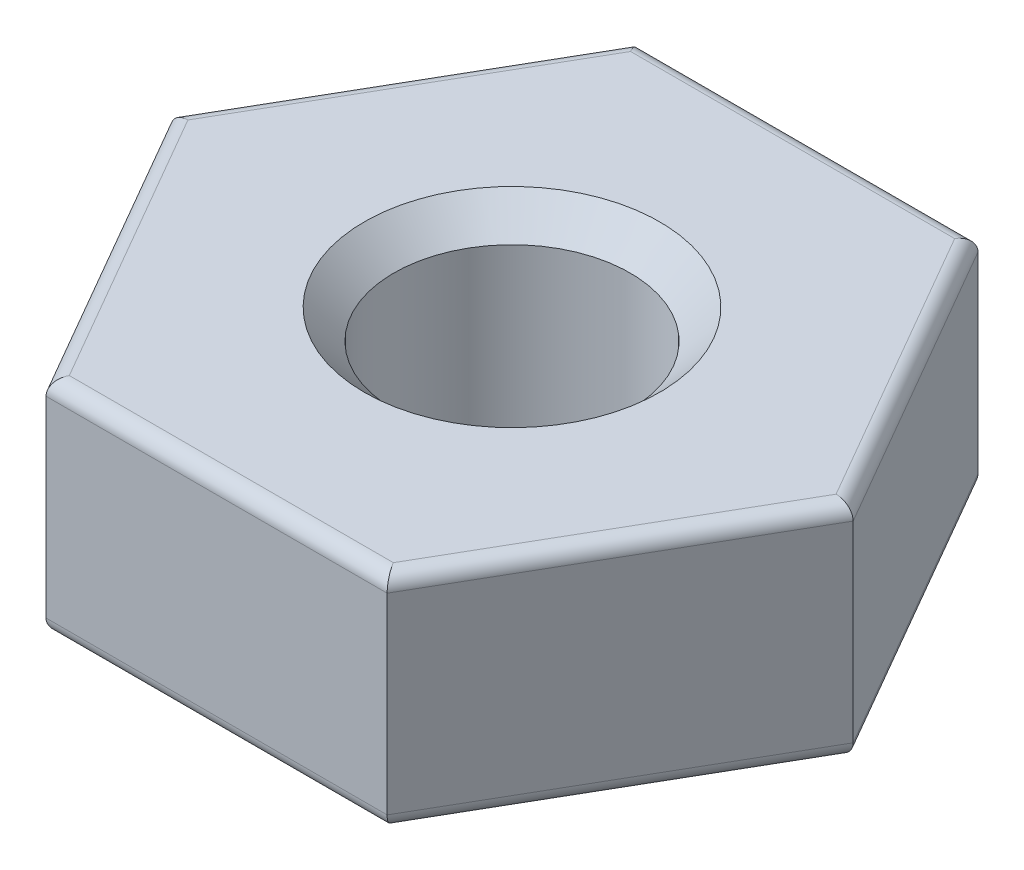
ISO-10303-21;
HEADER;
FILE_DESCRIPTION(('STEP AP214'),'2;1');
FILE_NAME('part.step','',(''),(''),'','','');
FILE_SCHEMA(('AUTOMOTIVE_DESIGN { 1 0 10303 214 1 1 1 1 }'));
ENDSEC;
DATA;
#1=APPLICATION_CONTEXT('core data for automotive mechanical design processes');
#2=APPLICATION_PROTOCOL_DEFINITION('international standard','automotive_design',2000,#1);
#3=PRODUCT_CONTEXT('',#1,'mechanical');
#4=PRODUCT('Part','Part','',(#3));
#5=PRODUCT_RELATED_PRODUCT_CATEGORY('part','',(#4));
#6=PRODUCT_DEFINITION_FORMATION('','',#4);
#7=PRODUCT_DEFINITION_CONTEXT('part definition',#1,'design');
#8=PRODUCT_DEFINITION('design','',#6,#7);
#9=PRODUCT_DEFINITION_SHAPE('','',#8);
#10=(LENGTH_UNIT() NAMED_UNIT(*) SI_UNIT(.MILLI.,.METRE.));
#11=(NAMED_UNIT(*) PLANE_ANGLE_UNIT() SI_UNIT($,.RADIAN.));
#12=(NAMED_UNIT(*) SI_UNIT($,.STERADIAN.) SOLID_ANGLE_UNIT());
#13=UNCERTAINTY_MEASURE_WITH_UNIT(LENGTH_MEASURE(1.E-05),#10,'distance_accuracy_value','');
#14=(GEOMETRIC_REPRESENTATION_CONTEXT(3) GLOBAL_UNCERTAINTY_ASSIGNED_CONTEXT((#13)) GLOBAL_UNIT_ASSIGNED_CONTEXT((#10,
#11,#12)) REPRESENTATION_CONTEXT('',''));
#15=CARTESIAN_POINT('',(0.,0.,0.));
#16=DIRECTION('',(0.,0.,1.));
#17=DIRECTION('',(1.,0.,0.));
#18=AXIS2_PLACEMENT_3D('',#15,#16,#17);
#19=CARTESIAN_POINT('',(1.15470053837927,1.5,1.99999999999998));
#20=DIRECTION('',(-0.866025403784441,0.,-0.499999999999995));
#21=DIRECTION('',(-0.499999999999995,0.,0.866025403784442));
#22=AXIS2_PLACEMENT_3D('',#19,#20,#21);
#23=PLANE('',#22);
#24=DIRECTION('',(0.,-1.,0.));
#25=VECTOR('',#24,1.);
#26=CARTESIAN_POINT('',(2.30940107675849,1.5,0.));
#27=LINE('',#26,#25);
#28=CARTESIAN_POINT('',(2.30940107675849,1.4,0.));
#29=VERTEX_POINT('',#28);
#30=CARTESIAN_POINT('',(2.30940107675849,0.1,0.));
#31=VERTEX_POINT('',#30);
#32=EDGE_CURVE('E156',#29,#31,#27,.T.);
#33=ORIENTED_EDGE('',*,*,#32,.F.);
#34=DIRECTION('',(0.499999999999995,0.,-0.866025403784442));
#35=VECTOR('',#34,1.);
#36=CARTESIAN_POINT('',(1.15470053837927,1.4,1.99999999999998));
#37=LINE('',#36,#35);
#38=CARTESIAN_POINT('',(1.15470053837927,1.4,1.99999999999998));
#39=VERTEX_POINT('',#38);
#40=EDGE_CURVE('E189',#29,#39,#37,.F.);
#41=ORIENTED_EDGE('',*,*,#40,.T.);
#42=DIRECTION('',(0.,-1.,0.));
#43=VECTOR('',#42,1.);
#44=CARTESIAN_POINT('',(1.15470053837927,1.5,1.99999999999998));
#45=LINE('',#44,#43);
#46=CARTESIAN_POINT('',(1.15470053837927,0.1,1.99999999999998));
#47=VERTEX_POINT('',#46);
#48=EDGE_CURVE('E210',#39,#47,#45,.T.);
#49=ORIENTED_EDGE('',*,*,#48,.T.);
#50=DIRECTION('',(0.499999999999995,0.,-0.866025403784442));
#51=VECTOR('',#50,1.);
#52=CARTESIAN_POINT('',(1.15470053837927,0.1,1.99999999999998));
#53=LINE('',#52,#51);
#54=EDGE_CURVE('E187',#47,#31,#53,.T.);
#55=ORIENTED_EDGE('',*,*,#54,.T.);
#56=EDGE_LOOP('',(#33,#41,#49,#55));
#57=FACE_BOUND('',#56,.T.);
#58=ADVANCED_FACE('F47',(#57),#23,.F.);
#59=CARTESIAN_POINT('',(2.30940107675849,1.5,0.));
#60=DIRECTION('',(-0.866025403784438,0.,0.500000000000001));
#61=DIRECTION('',(0.500000000000001,0.,0.866025403784438));
#62=AXIS2_PLACEMENT_3D('',#59,#60,#61);
#63=PLANE('',#62);
#64=DIRECTION('',(0.,-1.,0.));
#65=VECTOR('',#64,1.);
#66=CARTESIAN_POINT('',(1.15470053837924,1.5,-1.99999999999999));
#67=LINE('',#66,#65);
#68=CARTESIAN_POINT('',(1.15470053837924,1.4,-1.99999999999999));
#69=VERTEX_POINT('',#68);
#70=CARTESIAN_POINT('',(1.15470053837924,0.1,-1.99999999999999));
#71=VERTEX_POINT('',#70);
#72=EDGE_CURVE('E253',#69,#71,#67,.T.);
#73=ORIENTED_EDGE('',*,*,#72,.F.);
#74=DIRECTION('',(-0.500000000000001,0.,-0.866025403784438));
#75=VECTOR('',#74,1.);
#76=CARTESIAN_POINT('',(2.30940107675849,1.4,0.));
#77=LINE('',#76,#75);
#78=EDGE_CURVE('E185',#69,#29,#77,.F.);
#79=ORIENTED_EDGE('',*,*,#78,.T.);
#80=ORIENTED_EDGE('',*,*,#32,.T.);
#81=DIRECTION('',(-0.500000000000001,0.,-0.866025403784438));
#82=VECTOR('',#81,1.);
#83=CARTESIAN_POINT('',(2.30940107675849,0.1,0.));
#84=LINE('',#83,#82);
#85=EDGE_CURVE('E182',#31,#71,#84,.T.);
#86=ORIENTED_EDGE('',*,*,#85,.T.);
#87=EDGE_LOOP('',(#73,#79,#80,#86));
#88=FACE_BOUND('',#87,.T.);
#89=ADVANCED_FACE('F250',(#88),#63,.F.);
#90=CARTESIAN_POINT('',(1.15470053837924,1.5,-1.99999999999999));
#91=DIRECTION('',(0.,0.,1.));
#92=DIRECTION('',(1.,0.,0.));
#93=AXIS2_PLACEMENT_3D('',#90,#91,#92);
#94=PLANE('',#93);
#95=DIRECTION('',(0.,-1.,0.));
#96=VECTOR('',#95,1.);
#97=CARTESIAN_POINT('',(-1.15470053837925,1.5,-1.99999999999998));
#98=LINE('',#97,#96);
#99=CARTESIAN_POINT('',(-1.15470053837925,1.4,-1.99999999999998));
#100=VERTEX_POINT('',#99);
#101=CARTESIAN_POINT('',(-1.15470053837925,0.1,-1.99999999999998));
#102=VERTEX_POINT('',#101);
#103=EDGE_CURVE('E255',#100,#102,#98,.T.);
#104=ORIENTED_EDGE('',*,*,#103,.F.);
#105=DIRECTION('',(-1.,0.,0.));
#106=VECTOR('',#105,1.);
#107=CARTESIAN_POINT('',(1.15470053837924,1.4,-1.99999999999999));
#108=LINE('',#107,#106);
#109=EDGE_CURVE('E180',#100,#69,#108,.F.);
#110=ORIENTED_EDGE('',*,*,#109,.T.);
#111=ORIENTED_EDGE('',*,*,#72,.T.);
#112=DIRECTION('',(-1.,0.,0.));
#113=VECTOR('',#112,1.);
#114=CARTESIAN_POINT('',(1.15470053837924,0.1,-1.99999999999999));
#115=LINE('',#114,#113);
#116=EDGE_CURVE('E178',#71,#102,#115,.T.);
#117=ORIENTED_EDGE('',*,*,#116,.T.);
#118=EDGE_LOOP('',(#104,#110,#111,#117));
#119=FACE_BOUND('',#118,.T.);
#120=ADVANCED_FACE('F316',(#119),#94,.F.);
#121=CARTESIAN_POINT('',(-1.15470053837925,1.5,-1.99999999999998));
#122=DIRECTION('',(0.866025403784442,0.,0.499999999999995));
#123=DIRECTION('',(0.499999999999995,0.,-0.866025403784442));
#124=AXIS2_PLACEMENT_3D('',#121,#122,#123);
#125=PLANE('',#124);
#126=DIRECTION('',(0.,-1.,0.));
#127=VECTOR('',#126,1.);
#128=CARTESIAN_POINT('',(-2.30940107675849,1.5,0.));
#129=LINE('',#128,#127);
#130=CARTESIAN_POINT('',(-2.30940107675849,1.4,0.));
#131=VERTEX_POINT('',#130);
#132=CARTESIAN_POINT('',(-2.30940107675849,0.1,0.));
#133=VERTEX_POINT('',#132);
#134=EDGE_CURVE('E280',#131,#133,#129,.T.);
#135=ORIENTED_EDGE('',*,*,#134,.F.);
#136=DIRECTION('',(-0.499999999999995,0.,0.866025403784442));
#137=VECTOR('',#136,1.);
#138=CARTESIAN_POINT('',(-1.15470053837925,1.4,-1.99999999999999));
#139=LINE('',#138,#137);
#140=EDGE_CURVE('E176',#131,#100,#139,.F.);
#141=ORIENTED_EDGE('',*,*,#140,.T.);
#142=ORIENTED_EDGE('',*,*,#103,.T.);
#143=DIRECTION('',(-0.499999999999995,0.,0.866025403784442));
#144=VECTOR('',#143,1.);
#145=CARTESIAN_POINT('',(-1.15470053837925,0.1,-1.99999999999998));
#146=LINE('',#145,#144);
#147=EDGE_CURVE('E174',#102,#133,#146,.T.);
#148=ORIENTED_EDGE('',*,*,#147,.T.);
#149=EDGE_LOOP('',(#135,#141,#142,#148));
#150=FACE_BOUND('',#149,.T.);
#151=ADVANCED_FACE('F288',(#150),#125,.F.);
#152=CARTESIAN_POINT('',(-2.30940107675849,1.5,0.));
#153=DIRECTION('',(0.866025403784434,0.,-0.500000000000007));
#154=DIRECTION('',(-0.500000000000007,0.,-0.866025403784435));
#155=AXIS2_PLACEMENT_3D('',#152,#153,#154);
#156=PLANE('',#155);
#157=DIRECTION('',(0.,-1.,0.));
#158=VECTOR('',#157,1.);
#159=CARTESIAN_POINT('',(-1.15470053837923,1.5,2.));
#160=LINE('',#159,#158);
#161=CARTESIAN_POINT('',(-1.15470053837923,1.4,2.));
#162=VERTEX_POINT('',#161);
#163=CARTESIAN_POINT('',(-1.15470053837923,0.1,2.));
#164=VERTEX_POINT('',#163);
#165=EDGE_CURVE('E278',#162,#164,#160,.T.);
#166=ORIENTED_EDGE('',*,*,#165,.F.);
#167=DIRECTION('',(0.500000000000007,0.,0.866025403784435));
#168=VECTOR('',#167,1.);
#169=CARTESIAN_POINT('',(-2.30940107675849,1.4,0.));
#170=LINE('',#169,#168);
#171=EDGE_CURVE('E172',#162,#131,#170,.F.);
#172=ORIENTED_EDGE('',*,*,#171,.T.);
#173=ORIENTED_EDGE('',*,*,#134,.T.);
#174=DIRECTION('',(0.500000000000007,0.,0.866025403784435));
#175=VECTOR('',#174,1.);
#176=CARTESIAN_POINT('',(-2.30940107675849,0.1,0.));
#177=LINE('',#176,#175);
#178=EDGE_CURVE('E170',#133,#164,#177,.T.);
#179=ORIENTED_EDGE('',*,*,#178,.T.);
#180=EDGE_LOOP('',(#166,#172,#173,#179));
#181=FACE_BOUND('',#180,.T.);
#182=ADVANCED_FACE('F279',(#181),#156,.F.);
#183=CARTESIAN_POINT('',(-1.15470053837923,1.5,2.));
#184=DIRECTION('',(0.,0.,-1.));
#185=DIRECTION('',(-1.,0.,0.));
#186=AXIS2_PLACEMENT_3D('',#183,#184,#185);
#187=PLANE('',#186);
#188=ORIENTED_EDGE('',*,*,#48,.F.);
#189=DIRECTION('',(1.,0.,0.));
#190=VECTOR('',#189,1.);
#191=CARTESIAN_POINT('',(-1.15470053837923,1.4,2.));
#192=LINE('',#191,#190);
#193=EDGE_CURVE('E143',#39,#162,#192,.F.);
#194=ORIENTED_EDGE('',*,*,#193,.T.);
#195=ORIENTED_EDGE('',*,*,#165,.T.);
#196=DIRECTION('',(1.,0.,0.));
#197=VECTOR('',#196,1.);
#198=CARTESIAN_POINT('',(-1.15470053837923,0.1,2.));
#199=LINE('',#198,#197);
#200=EDGE_CURVE('E162',#164,#47,#199,.T.);
#201=ORIENTED_EDGE('',*,*,#200,.T.);
#202=EDGE_LOOP('',(#188,#194,#195,#201));
#203=FACE_BOUND('',#202,.T.);
#204=ADVANCED_FACE('F277',(#203),#187,.F.);
#205=CARTESIAN_POINT('',(0.,1.5,0.));
#206=DIRECTION('',(0.,1.,0.));
#207=DIRECTION('',(0.,0.,1.));
#208=AXIS2_PLACEMENT_3D('',#205,#206,#207);
#209=PLANE('',#208);
#210=CARTESIAN_POINT('',(0.,1.5,0.));
#211=DIRECTION('',(0.,1.,0.));
#212=DIRECTION('',(0.,0.,1.));
#213=AXIS2_PLACEMENT_3D('',#210,#211,#212);
#214=CIRCLE('',#213,1.);
#215=CARTESIAN_POINT('',(0.,1.5,1.));
#216=VERTEX_POINT('',#215);
#217=EDGE_CURVE('E367',#216,#216,#214,.T.);
#218=ORIENTED_EDGE('',*,*,#217,.F.);
#219=EDGE_LOOP('',(#218));
#220=FACE_BOUND('',#219,.T.);
#221=DIRECTION('',(0.500000000000007,0.,0.866025403784435));
#222=VECTOR('',#221,1.);
#223=CARTESIAN_POINT('',(-1.06809799800078,1.5,1.95));
#224=LINE('',#223,#222);
#225=CARTESIAN_POINT('',(-2.19393102292057,1.5,0.));
#226=VERTEX_POINT('',#225);
#227=CARTESIAN_POINT('',(-1.09696551146027,1.5,1.9));
#228=VERTEX_POINT('',#227);
#229=EDGE_CURVE('E160',#226,#228,#224,.T.);
#230=ORIENTED_EDGE('',*,*,#229,.T.);
#231=DIRECTION('',(1.,0.,0.));
#232=VECTOR('',#231,1.);
#233=CARTESIAN_POINT('',(1.15470053837927,1.5,1.89999999999998));
#234=LINE('',#233,#232);
#235=CARTESIAN_POINT('',(1.09696551146031,1.5,1.89999999999998));
#236=VERTEX_POINT('',#235);
#237=EDGE_CURVE('E141',#228,#236,#234,.T.);
#238=ORIENTED_EDGE('',*,*,#237,.T.);
#239=DIRECTION('',(0.499999999999995,0.,-0.866025403784442));
#240=VECTOR('',#239,1.);
#241=CARTESIAN_POINT('',(2.22279853638005,1.5,-0.0500000000000001));
#242=LINE('',#241,#240);
#243=CARTESIAN_POINT('',(2.19393102292057,1.5,0.));
#244=VERTEX_POINT('',#243);
#245=EDGE_CURVE('E149',#236,#244,#242,.T.);
#246=ORIENTED_EDGE('',*,*,#245,.T.);
#247=DIRECTION('',(-0.500000000000001,0.,-0.866025403784438));
#248=VECTOR('',#247,1.);
#249=CARTESIAN_POINT('',(1.0680979980008,1.5,-1.94999999999999));
#250=LINE('',#249,#248);
#251=CARTESIAN_POINT('',(1.09696551146028,1.5,-1.89999999999999));
#252=VERTEX_POINT('',#251);
#253=EDGE_CURVE('E155',#244,#252,#250,.T.);
#254=ORIENTED_EDGE('',*,*,#253,.T.);
#255=DIRECTION('',(-1.,0.,0.));
#256=VECTOR('',#255,1.);
#257=CARTESIAN_POINT('',(-1.15470053837925,1.5,-1.89999999999998));
#258=LINE('',#257,#256);
#259=CARTESIAN_POINT('',(-1.09696551146029,1.5,-1.89999999999999));
#260=VERTEX_POINT('',#259);
#261=EDGE_CURVE('E260',#252,#260,#258,.T.);
#262=ORIENTED_EDGE('',*,*,#261,.T.);
#263=DIRECTION('',(-0.499999999999995,0.,0.866025403784442));
#264=VECTOR('',#263,1.);
#265=CARTESIAN_POINT('',(-2.22279853638005,1.5,0.0500000000000156));
#266=LINE('',#265,#264);
#267=EDGE_CURVE('E165',#260,#226,#266,.T.);
#268=ORIENTED_EDGE('',*,*,#267,.T.);
#269=EDGE_LOOP('',(#230,#238,#246,#254,#262,#268));
#270=FACE_BOUND('',#269,.T.);
#271=ADVANCED_FACE('F158',(#220,#270),#209,.T.);
#272=CARTESIAN_POINT('',(0.,0.,0.));
#273=DIRECTION('',(0.,1.,0.));
#274=DIRECTION('',(0.,0.,1.));
#275=AXIS2_PLACEMENT_3D('',#272,#273,#274);
#276=PLANE('',#275);
#277=CARTESIAN_POINT('',(0.,0.,0.));
#278=DIRECTION('',(0.,1.,0.));
#279=DIRECTION('',(0.,0.,1.));
#280=AXIS2_PLACEMENT_3D('',#277,#278,#279);
#281=CIRCLE('',#280,0.824999999999999);
#282=CARTESIAN_POINT('',(0.,0.,0.824999999999999));
#283=VERTEX_POINT('',#282);
#284=EDGE_CURVE('E368',#283,#283,#281,.T.);
#285=ORIENTED_EDGE('',*,*,#284,.T.);
#286=EDGE_LOOP('',(#285));
#287=FACE_BOUND('',#286,.T.);
#288=DIRECTION('',(-1.,0.,0.));
#289=VECTOR('',#288,1.);
#290=CARTESIAN_POINT('',(0.,0.,-1.89999999999999));
#291=LINE('',#290,#289);
#292=CARTESIAN_POINT('',(-1.09696551146029,0.,-1.89999999999999));
#293=VERTEX_POINT('',#292);
#294=CARTESIAN_POINT('',(1.09696551146028,0.,-1.89999999999999));
#295=VERTEX_POINT('',#294);
#296=EDGE_CURVE('E56',#293,#295,#291,.F.);
#297=ORIENTED_EDGE('',*,*,#296,.T.);
#298=DIRECTION('',(-0.500000000000001,0.,-0.866025403784438));
#299=VECTOR('',#298,1.);
#300=CARTESIAN_POINT('',(1.64544826719042,0.,-0.949999999999997));
#301=LINE('',#300,#299);
#302=CARTESIAN_POINT('',(2.19393102292057,0.,0.));
#303=VERTEX_POINT('',#302);
#304=EDGE_CURVE('E11',#295,#303,#301,.F.);
#305=ORIENTED_EDGE('',*,*,#304,.T.);
#306=DIRECTION('',(0.499999999999995,0.,-0.866025403784442));
#307=VECTOR('',#306,1.);
#308=CARTESIAN_POINT('',(1.64544826719044,0.,0.949999999999989));
#309=LINE('',#308,#307);
#310=CARTESIAN_POINT('',(1.09696551146031,0.,1.89999999999998));
#311=VERTEX_POINT('',#310);
#312=EDGE_CURVE('E191',#303,#311,#309,.F.);
#313=ORIENTED_EDGE('',*,*,#312,.T.);
#314=DIRECTION('',(1.,0.,0.));
#315=VECTOR('',#314,1.);
#316=CARTESIAN_POINT('',(0.,0.,1.89999999999999));
#317=LINE('',#316,#315);
#318=CARTESIAN_POINT('',(-1.09696551146027,0.,1.9));
#319=VERTEX_POINT('',#318);
#320=EDGE_CURVE('E193',#311,#319,#317,.F.);
#321=ORIENTED_EDGE('',*,*,#320,.T.);
#322=DIRECTION('',(0.500000000000007,0.,0.866025403784435));
#323=VECTOR('',#322,1.);
#324=CARTESIAN_POINT('',(-1.64544826719042,0.,0.950000000000008));
#325=LINE('',#324,#323);
#326=CARTESIAN_POINT('',(-2.19393102292057,0.,0.));
#327=VERTEX_POINT('',#326);
#328=EDGE_CURVE('E195',#319,#327,#325,.F.);
#329=ORIENTED_EDGE('',*,*,#328,.T.);
#330=DIRECTION('',(-0.499999999999995,0.,0.866025403784442));
#331=VECTOR('',#330,1.);
#332=CARTESIAN_POINT('',(-1.64544826719043,0.,-0.949999999999985));
#333=LINE('',#332,#331);
#334=EDGE_CURVE('E67',#327,#293,#333,.F.);
#335=ORIENTED_EDGE('',*,*,#334,.T.);
#336=EDGE_LOOP('',(#297,#305,#313,#321,#329,#335));
#337=FACE_BOUND('',#336,.T.);
#338=ADVANCED_FACE('F236',(#287,#337),#276,.F.);
#339=CARTESIAN_POINT('',(0.,1.4,-1.89999999999999));
#340=DIRECTION('',(1.,0.,0.));
#341=DIRECTION('',(0.,0.,-1.));
#342=AXIS2_PLACEMENT_3D('',#339,#340,#341);
#343=CYLINDRICAL_SURFACE('',#342,0.1);
#344=CARTESIAN_POINT('',(1.09696551146028,1.4,-1.89999999999999));
#345=DIRECTION('',(0.86602540378444,0.,0.499999999999998));
#346=DIRECTION('',(-0.499999999999998,0.,0.86602540378444));
#347=AXIS2_PLACEMENT_3D('',#344,#345,#346);
#348=ELLIPSE('',#347,0.115470053837925,0.1);
#349=EDGE_CURVE('E204',#69,#252,#348,.T.);
#350=ORIENTED_EDGE('',*,*,#349,.F.);
#351=ORIENTED_EDGE('',*,*,#109,.F.);
#352=CARTESIAN_POINT('',(-1.09696551146029,1.4,-1.89999999999999));
#353=DIRECTION('',(0.866025403784436,0.,-0.500000000000004));
#354=DIRECTION('',(0.500000000000004,0.,0.866025403784436));
#355=AXIS2_PLACEMENT_3D('',#352,#353,#354);
#356=ELLIPSE('',#355,0.115470053837925,0.1);
#357=EDGE_CURVE('E207',#260,#100,#356,.F.);
#358=ORIENTED_EDGE('',*,*,#357,.F.);
#359=ORIENTED_EDGE('',*,*,#261,.F.);
#360=EDGE_LOOP('',(#350,#351,#358,#359));
#361=FACE_BOUND('',#360,.T.);
#362=ADVANCED_FACE('F331',(#361),#343,.T.);
#363=CARTESIAN_POINT('',(-1.64544826719043,1.4,-0.949999999999985));
#364=DIRECTION('',(0.499999999999995,0.,-0.866025403784442));
#365=DIRECTION('',(-0.866025403784442,0.,-0.499999999999995));
#366=AXIS2_PLACEMENT_3D('',#363,#364,#365);
#367=CYLINDRICAL_SURFACE('',#366,0.1);
#368=ORIENTED_EDGE('',*,*,#357,.T.);
#369=ORIENTED_EDGE('',*,*,#140,.F.);
#370=CARTESIAN_POINT('',(-2.19393102292057,1.4,0.));
#371=DIRECTION('',(0.,0.,-1.));
#372=DIRECTION('',(1.,0.,0.));
#373=AXIS2_PLACEMENT_3D('',#370,#371,#372);
#374=ELLIPSE('',#373,0.115470053837925,0.1);
#375=EDGE_CURVE('E201',#226,#131,#374,.F.);
#376=ORIENTED_EDGE('',*,*,#375,.F.);
#377=ORIENTED_EDGE('',*,*,#267,.F.);
#378=EDGE_LOOP('',(#368,#369,#376,#377));
#379=FACE_BOUND('',#378,.T.);
#380=ADVANCED_FACE('F267',(#379),#367,.T.);
#381=CARTESIAN_POINT('',(1.64544826719042,1.4,-0.949999999999997));
#382=DIRECTION('',(0.500000000000001,0.,0.866025403784438));
#383=DIRECTION('',(0.866025403784438,0.,-0.500000000000001));
#384=AXIS2_PLACEMENT_3D('',#381,#382,#383);
#385=CYLINDRICAL_SURFACE('',#384,0.1);
#386=ORIENTED_EDGE('',*,*,#349,.T.);
#387=ORIENTED_EDGE('',*,*,#253,.F.);
#388=CARTESIAN_POINT('',(2.19393102292057,1.4,0.));
#389=DIRECTION('',(0.,0.,1.));
#390=DIRECTION('',(-1.,0.,0.));
#391=AXIS2_PLACEMENT_3D('',#388,#389,#390);
#392=ELLIPSE('',#391,0.115470053837925,0.1);
#393=EDGE_CURVE('E152',#29,#244,#392,.T.);
#394=ORIENTED_EDGE('',*,*,#393,.F.);
#395=ORIENTED_EDGE('',*,*,#78,.F.);
#396=EDGE_LOOP('',(#386,#387,#394,#395));
#397=FACE_BOUND('',#396,.T.);
#398=ADVANCED_FACE('F326',(#397),#385,.T.);
#399=CARTESIAN_POINT('',(-1.64544826719042,1.4,0.950000000000008));
#400=DIRECTION('',(-0.500000000000007,0.,-0.866025403784435));
#401=DIRECTION('',(-0.866025403784435,0.,0.500000000000007));
#402=AXIS2_PLACEMENT_3D('',#399,#400,#401);
#403=CYLINDRICAL_SURFACE('',#402,0.1);
#404=ORIENTED_EDGE('',*,*,#375,.T.);
#405=ORIENTED_EDGE('',*,*,#171,.F.);
#406=CARTESIAN_POINT('',(-1.09696551146027,1.4,1.9));
#407=DIRECTION('',(-0.866025403784443,0.,-0.499999999999992));
#408=DIRECTION('',(0.499999999999992,0.,-0.866025403784443));
#409=AXIS2_PLACEMENT_3D('',#406,#407,#408);
#410=ELLIPSE('',#409,0.115470053837925,0.1);
#411=EDGE_CURVE('E146',#228,#162,#410,.F.);
#412=ORIENTED_EDGE('',*,*,#411,.F.);
#413=ORIENTED_EDGE('',*,*,#229,.F.);
#414=EDGE_LOOP('',(#404,#405,#412,#413));
#415=FACE_BOUND('',#414,.T.);
#416=ADVANCED_FACE('F270',(#415),#403,.T.);
#417=CARTESIAN_POINT('',(1.64544826719044,1.4,0.949999999999989));
#418=DIRECTION('',(-0.499999999999995,0.,0.866025403784442));
#419=DIRECTION('',(0.866025403784441,0.,0.499999999999995));
#420=AXIS2_PLACEMENT_3D('',#417,#418,#419);
#421=CYLINDRICAL_SURFACE('',#420,0.1);
#422=ORIENTED_EDGE('',*,*,#393,.T.);
#423=ORIENTED_EDGE('',*,*,#245,.F.);
#424=CARTESIAN_POINT('',(1.09696551146031,1.4,1.89999999999998));
#425=DIRECTION('',(-0.866025403784435,0.,0.500000000000007));
#426=DIRECTION('',(0.500000000000007,0.,0.866025403784435));
#427=AXIS2_PLACEMENT_3D('',#424,#425,#426);
#428=ELLIPSE('',#427,0.115470053837925,0.1);
#429=EDGE_CURVE('E137',#39,#236,#428,.T.);
#430=ORIENTED_EDGE('',*,*,#429,.F.);
#431=ORIENTED_EDGE('',*,*,#40,.F.);
#432=EDGE_LOOP('',(#422,#423,#430,#431));
#433=FACE_BOUND('',#432,.T.);
#434=ADVANCED_FACE('F150',(#433),#421,.T.);
#435=CARTESIAN_POINT('',(0.,1.4,1.89999999999999));
#436=DIRECTION('',(-1.,0.,0.));
#437=DIRECTION('',(0.,0.,1.));
#438=AXIS2_PLACEMENT_3D('',#435,#436,#437);
#439=CYLINDRICAL_SURFACE('',#438,0.1);
#440=ORIENTED_EDGE('',*,*,#411,.T.);
#441=ORIENTED_EDGE('',*,*,#193,.F.);
#442=ORIENTED_EDGE('',*,*,#429,.T.);
#443=ORIENTED_EDGE('',*,*,#237,.F.);
#444=EDGE_LOOP('',(#440,#441,#442,#443));
#445=FACE_BOUND('',#444,.T.);
#446=ADVANCED_FACE('F139',(#445),#439,.T.);
#447=CARTESIAN_POINT('',(-2.22279853638005,0.1,-0.0499999999999846));
#448=DIRECTION('',(0.500000000000007,0.,0.866025403784435));
#449=DIRECTION('',(0.866025403784435,0.,-0.500000000000007));
#450=AXIS2_PLACEMENT_3D('',#447,#448,#449);
#451=CYLINDRICAL_SURFACE('',#450,0.1);
#452=CARTESIAN_POINT('',(-2.19393102292057,0.1,0.));
#453=DIRECTION('',(0.,0.,1.));
#454=DIRECTION('',(1.,0.,0.));
#455=AXIS2_PLACEMENT_3D('',#452,#453,#454);
#456=ELLIPSE('',#455,0.115470053837925,0.1);
#457=EDGE_CURVE('E221',#327,#133,#456,.F.);
#458=ORIENTED_EDGE('',*,*,#457,.F.);
#459=ORIENTED_EDGE('',*,*,#328,.F.);
#460=CARTESIAN_POINT('',(-1.09696551146027,0.1,1.9));
#461=DIRECTION('',(0.866025403784443,0.,0.499999999999992));
#462=DIRECTION('',(0.499999999999992,0.,-0.866025403784443));
#463=AXIS2_PLACEMENT_3D('',#460,#461,#462);
#464=ELLIPSE('',#463,0.115470053837925,0.1);
#465=EDGE_CURVE('E51',#164,#319,#464,.T.);
#466=ORIENTED_EDGE('',*,*,#465,.F.);
#467=ORIENTED_EDGE('',*,*,#178,.F.);
#468=EDGE_LOOP('',(#458,#459,#466,#467));
#469=FACE_BOUND('',#468,.T.);
#470=ADVANCED_FACE('F49',(#469),#451,.T.);
#471=CARTESIAN_POINT('',(-1.15470053837923,0.1,1.9));
#472=DIRECTION('',(1.,0.,0.));
#473=DIRECTION('',(0.,0.,-1.));
#474=AXIS2_PLACEMENT_3D('',#471,#472,#473);
#475=CYLINDRICAL_SURFACE('',#474,0.1);
#476=ORIENTED_EDGE('',*,*,#465,.T.);
#477=ORIENTED_EDGE('',*,*,#320,.F.);
#478=CARTESIAN_POINT('',(1.09696551146031,0.1,1.89999999999998));
#479=DIRECTION('',(0.866025403784435,0.,-0.500000000000007));
#480=DIRECTION('',(-0.500000000000007,0.,-0.866025403784435));
#481=AXIS2_PLACEMENT_3D('',#478,#479,#480);
#482=ELLIPSE('',#481,0.115470053837925,0.1);
#483=EDGE_CURVE('E219',#47,#311,#482,.T.);
#484=ORIENTED_EDGE('',*,*,#483,.F.);
#485=ORIENTED_EDGE('',*,*,#200,.F.);
#486=EDGE_LOOP('',(#476,#477,#484,#485));
#487=FACE_BOUND('',#486,.T.);
#488=ADVANCED_FACE('F231',(#487),#475,.T.);
#489=CARTESIAN_POINT('',(-1.06809799800081,0.1,-1.94999999999999));
#490=DIRECTION('',(-0.499999999999995,0.,0.866025403784442));
#491=DIRECTION('',(0.866025403784442,0.,0.499999999999995));
#492=AXIS2_PLACEMENT_3D('',#489,#490,#491);
#493=CYLINDRICAL_SURFACE('',#492,0.1);
#494=ORIENTED_EDGE('',*,*,#457,.T.);
#495=ORIENTED_EDGE('',*,*,#147,.F.);
#496=CARTESIAN_POINT('',(-1.09696551146029,0.1,-1.89999999999999));
#497=DIRECTION('',(-0.866025403784436,0.,0.500000000000004));
#498=DIRECTION('',(0.500000000000004,0.,0.866025403784436));
#499=AXIS2_PLACEMENT_3D('',#496,#497,#498);
#500=ELLIPSE('',#499,0.115470053837925,0.1);
#501=EDGE_CURVE('E216',#293,#102,#500,.F.);
#502=ORIENTED_EDGE('',*,*,#501,.F.);
#503=ORIENTED_EDGE('',*,*,#334,.F.);
#504=EDGE_LOOP('',(#494,#495,#502,#503));
#505=FACE_BOUND('',#504,.T.);
#506=ADVANCED_FACE('F291',(#505),#493,.T.);
#507=CARTESIAN_POINT('',(1.06809799800082,0.1,1.94999999999998));
#508=DIRECTION('',(0.499999999999995,0.,-0.866025403784442));
#509=DIRECTION('',(-0.866025403784441,0.,-0.499999999999995));
#510=AXIS2_PLACEMENT_3D('',#507,#508,#509);
#511=CYLINDRICAL_SURFACE('',#510,0.1);
#512=ORIENTED_EDGE('',*,*,#483,.T.);
#513=ORIENTED_EDGE('',*,*,#312,.F.);
#514=CARTESIAN_POINT('',(2.19393102292057,0.1,0.));
#515=DIRECTION('',(0.,0.,-1.));
#516=DIRECTION('',(1.,0.,0.));
#517=AXIS2_PLACEMENT_3D('',#514,#515,#516);
#518=ELLIPSE('',#517,0.115470053837925,0.1);
#519=EDGE_CURVE('E213',#31,#303,#518,.T.);
#520=ORIENTED_EDGE('',*,*,#519,.F.);
#521=ORIENTED_EDGE('',*,*,#54,.F.);
#522=EDGE_LOOP('',(#512,#513,#520,#521));
#523=FACE_BOUND('',#522,.T.);
#524=ADVANCED_FACE('F240',(#523),#511,.T.);
#525=CARTESIAN_POINT('',(1.15470053837924,0.1,-1.89999999999999));
#526=DIRECTION('',(-1.,0.,0.));
#527=DIRECTION('',(0.,0.,1.));
#528=AXIS2_PLACEMENT_3D('',#525,#526,#527);
#529=CYLINDRICAL_SURFACE('',#528,0.1);
#530=ORIENTED_EDGE('',*,*,#501,.T.);
#531=ORIENTED_EDGE('',*,*,#116,.F.);
#532=CARTESIAN_POINT('',(1.09696551146028,0.1,-1.89999999999999));
#533=DIRECTION('',(-0.86602540378444,0.,-0.499999999999998));
#534=DIRECTION('',(-0.499999999999998,0.,0.86602540378444));
#535=AXIS2_PLACEMENT_3D('',#532,#533,#534);
#536=ELLIPSE('',#535,0.115470053837925,0.1);
#537=EDGE_CURVE('E211',#295,#71,#536,.F.);
#538=ORIENTED_EDGE('',*,*,#537,.F.);
#539=ORIENTED_EDGE('',*,*,#296,.F.);
#540=EDGE_LOOP('',(#530,#531,#538,#539));
#541=FACE_BOUND('',#540,.T.);
#542=ADVANCED_FACE('F294',(#541),#529,.T.);
#543=CARTESIAN_POINT('',(2.22279853638005,0.1,0.0500000000000001));
#544=DIRECTION('',(-0.500000000000001,0.,-0.866025403784438));
#545=DIRECTION('',(-0.866025403784438,0.,0.500000000000001));
#546=AXIS2_PLACEMENT_3D('',#543,#544,#545);
#547=CYLINDRICAL_SURFACE('',#546,0.1);
#548=ORIENTED_EDGE('',*,*,#519,.T.);
#549=ORIENTED_EDGE('',*,*,#304,.F.);
#550=ORIENTED_EDGE('',*,*,#537,.T.);
#551=ORIENTED_EDGE('',*,*,#85,.F.);
#552=EDGE_LOOP('',(#548,#549,#550,#551));
#553=FACE_BOUND('',#552,.T.);
#554=ADVANCED_FACE('F297',(#553),#547,.T.);
#555=CARTESIAN_POINT('',(0.,0.0249999999999996,0.));
#556=DIRECTION('',(0.,-1.,0.));
#557=DIRECTION('',(0.,0.,-1.));
#558=AXIS2_PLACEMENT_3D('',#555,#556,#557);
#559=CONICAL_SURFACE('',#558,0.8,0.785398163397459);
#560=ORIENTED_EDGE('',*,*,#284,.F.);
#561=EDGE_LOOP('',(#560));
#562=FACE_BOUND('',#561,.T.);
#563=CARTESIAN_POINT('',(0.,0.0249999999999996,0.));
#564=DIRECTION('',(0.,1.,0.));
#565=DIRECTION('',(0.,0.,1.));
#566=AXIS2_PLACEMENT_3D('',#563,#564,#565);
#567=CIRCLE('',#566,0.8);
#568=CARTESIAN_POINT('',(0.,0.0249999999999996,0.8));
#569=VERTEX_POINT('',#568);
#570=EDGE_CURVE('E214',#569,#569,#567,.T.);
#571=ORIENTED_EDGE('',*,*,#570,.T.);
#572=EDGE_LOOP('',(#571));
#573=FACE_BOUND('',#572,.T.);
#574=ADVANCED_FACE('F299',(#562,#573),#559,.F.);
#575=CARTESIAN_POINT('',(0.,1.5,0.));
#576=DIRECTION('',(0.,1.,0.));
#577=DIRECTION('',(0.,0.,1.));
#578=AXIS2_PLACEMENT_3D('',#575,#576,#577);
#579=CYLINDRICAL_SURFACE('',#578,0.8);
#580=ORIENTED_EDGE('',*,*,#570,.F.);
#581=EDGE_LOOP('',(#580));
#582=FACE_BOUND('',#581,.T.);
#583=CARTESIAN_POINT('',(0.,1.3,0.));
#584=DIRECTION('',(0.,1.,0.));
#585=DIRECTION('',(0.,0.,1.));
#586=AXIS2_PLACEMENT_3D('',#583,#584,#585);
#587=CIRCLE('',#586,0.8);
#588=CARTESIAN_POINT('',(0.,1.3,0.8));
#589=VERTEX_POINT('',#588);
#590=EDGE_CURVE('E364',#589,#589,#587,.T.);
#591=ORIENTED_EDGE('',*,*,#590,.T.);
#592=EDGE_LOOP('',(#591));
#593=FACE_BOUND('',#592,.T.);
#594=ADVANCED_FACE('F306',(#582,#593),#579,.F.);
#595=CARTESIAN_POINT('',(0.,1.5,0.));
#596=DIRECTION('',(0.,1.,0.));
#597=DIRECTION('',(0.,0.,1.));
#598=AXIS2_PLACEMENT_3D('',#595,#596,#597);
#599=CONICAL_SURFACE('',#598,1.,0.785398163397449);
#600=ORIENTED_EDGE('',*,*,#590,.F.);
#601=EDGE_LOOP('',(#600));
#602=FACE_BOUND('',#601,.T.);
#603=ORIENTED_EDGE('',*,*,#217,.T.);
#604=EDGE_LOOP('',(#603));
#605=FACE_BOUND('',#604,.T.);
#606=ADVANCED_FACE('F354',(#602,#605),#599,.F.);
#607=CLOSED_SHELL('',(#58,#89,#120,#151,#182,#204,#271,#338,#362,#380,#398,#416,#434,#446,#470,
#488,#506,#524,#542,#554,#574,#594,#606));
#608=MANIFOLD_SOLID_BREP('B2',#607);
#609=ADVANCED_BREP_SHAPE_REPRESENTATION('',(#18,#608),#14);
#610=SHAPE_DEFINITION_REPRESENTATION(#9,#609);
ENDSEC;
END-ISO-10303-21;
